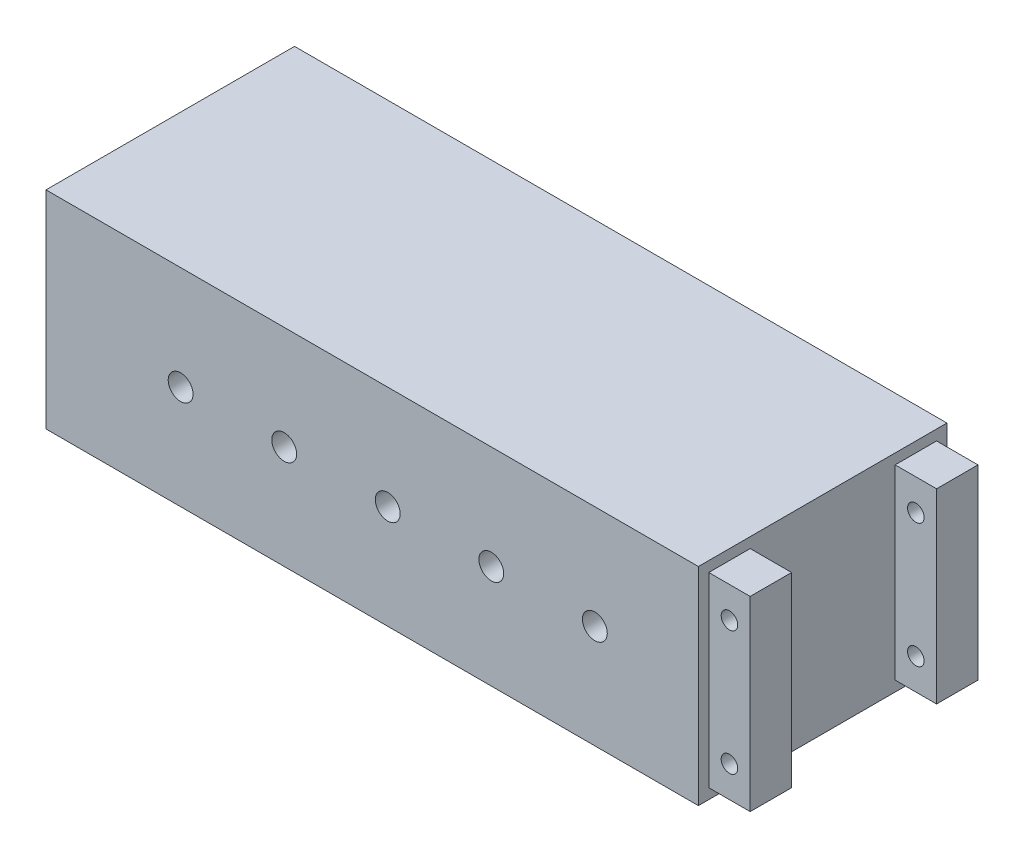
ISO-10303-21;
HEADER;
FILE_DESCRIPTION(('STEP AP214'),'2;1');
FILE_NAME('part.step','',(''),(''),'','','');
FILE_SCHEMA(('AUTOMOTIVE_DESIGN { 1 0 10303 214 1 1 1 1 }'));
ENDSEC;
DATA;
#1=APPLICATION_CONTEXT('core data for automotive mechanical design processes');
#2=APPLICATION_PROTOCOL_DEFINITION('international standard','automotive_design',2000,#1);
#3=PRODUCT_CONTEXT('',#1,'mechanical');
#4=PRODUCT('Part','Part','',(#3));
#5=PRODUCT_RELATED_PRODUCT_CATEGORY('part','',(#4));
#6=PRODUCT_DEFINITION_FORMATION('','',#4);
#7=PRODUCT_DEFINITION_CONTEXT('part definition',#1,'design');
#8=PRODUCT_DEFINITION('design','',#6,#7);
#9=PRODUCT_DEFINITION_SHAPE('','',#8);
#10=(LENGTH_UNIT() NAMED_UNIT(*) SI_UNIT(.MILLI.,.METRE.));
#11=(NAMED_UNIT(*) PLANE_ANGLE_UNIT() SI_UNIT($,.RADIAN.));
#12=(NAMED_UNIT(*) SI_UNIT($,.STERADIAN.) SOLID_ANGLE_UNIT());
#13=UNCERTAINTY_MEASURE_WITH_UNIT(LENGTH_MEASURE(1.E-05),#10,'distance_accuracy_value','');
#14=(GEOMETRIC_REPRESENTATION_CONTEXT(3) GLOBAL_UNCERTAINTY_ASSIGNED_CONTEXT((#13)) GLOBAL_UNIT_ASSIGNED_CONTEXT((#10,
#11,#12)) REPRESENTATION_CONTEXT('',''));
#15=CARTESIAN_POINT('',(0.,0.,0.));
#16=DIRECTION('',(0.,0.,1.));
#17=DIRECTION('',(1.,0.,0.));
#18=AXIS2_PLACEMENT_3D('',#15,#16,#17);
#19=CARTESIAN_POINT('',(157.5,35.,15.));
#20=DIRECTION('',(0.,0.,1.));
#21=DIRECTION('',(0.,-1.,0.));
#22=AXIS2_PLACEMENT_3D('',#19,#20,#21);
#23=PLANE('',#22);
#24=DIRECTION('',(0.,-1.,0.));
#25=VECTOR('',#24,1.);
#26=CARTESIAN_POINT('',(-10.,35.,15.));
#27=LINE('',#26,#25);
#28=CARTESIAN_POINT('',(-10.,35.,15.));
#29=VERTEX_POINT('',#28);
#30=CARTESIAN_POINT('',(-10.,15.,15.));
#31=VERTEX_POINT('',#30);
#32=EDGE_CURVE('E58',#29,#31,#27,.T.);
#33=ORIENTED_EDGE('',*,*,#32,.T.);
#34=DIRECTION('',(-1.,0.,0.));
#35=VECTOR('',#34,1.);
#36=CARTESIAN_POINT('',(157.5,15.,15.));
#37=LINE('',#36,#35);
#38=CARTESIAN_POINT('',(-157.5,15.,15.));
#39=VERTEX_POINT('',#38);
#40=EDGE_CURVE('E347',#31,#39,#37,.T.);
#41=ORIENTED_EDGE('',*,*,#40,.T.);
#42=DIRECTION('',(0.,1.,0.));
#43=VECTOR('',#42,1.);
#44=CARTESIAN_POINT('',(-157.5,35.,15.));
#45=LINE('',#44,#43);
#46=CARTESIAN_POINT('',(-157.5,35.,15.));
#47=VERTEX_POINT('',#46);
#48=EDGE_CURVE('E304',#39,#47,#45,.T.);
#49=ORIENTED_EDGE('',*,*,#48,.T.);
#50=DIRECTION('',(-1.,0.,0.));
#51=VECTOR('',#50,1.);
#52=CARTESIAN_POINT('',(157.5,35.,15.));
#53=LINE('',#52,#51);
#54=EDGE_CURVE('E45',#29,#47,#53,.T.);
#55=ORIENTED_EDGE('',*,*,#54,.F.);
#56=EDGE_LOOP('',(#33,#41,#49,#55));
#57=FACE_BOUND('',#56,.T.);
#58=ADVANCED_FACE('F41',(#57),#23,.F.);
#59=CARTESIAN_POINT('',(157.5,15.,-15.));
#60=DIRECTION('',(0.,-1.,0.));
#61=DIRECTION('',(0.,0.,-1.));
#62=AXIS2_PLACEMENT_3D('',#59,#60,#61);
#63=PLANE('',#62);
#64=DIRECTION('',(0.,0.,-1.));
#65=VECTOR('',#64,1.);
#66=CARTESIAN_POINT('',(-10.,15.,15.));
#67=LINE('',#66,#65);
#68=CARTESIAN_POINT('',(-10.,15.,-15.));
#69=VERTEX_POINT('',#68);
#70=EDGE_CURVE('E65',#31,#69,#67,.T.);
#71=ORIENTED_EDGE('',*,*,#70,.T.);
#72=DIRECTION('',(-1.,0.,0.));
#73=VECTOR('',#72,1.);
#74=CARTESIAN_POINT('',(157.5,15.,-15.));
#75=LINE('',#74,#73);
#76=CARTESIAN_POINT('',(-157.5,15.,-15.));
#77=VERTEX_POINT('',#76);
#78=EDGE_CURVE('E166',#69,#77,#75,.T.);
#79=ORIENTED_EDGE('',*,*,#78,.T.);
#80=DIRECTION('',(0.,0.,1.));
#81=VECTOR('',#80,1.);
#82=CARTESIAN_POINT('',(-157.5,15.,-15.));
#83=LINE('',#82,#81);
#84=EDGE_CURVE('E298',#77,#39,#83,.T.);
#85=ORIENTED_EDGE('',*,*,#84,.T.);
#86=ORIENTED_EDGE('',*,*,#40,.F.);
#87=EDGE_LOOP('',(#71,#79,#85,#86));
#88=FACE_BOUND('',#87,.T.);
#89=ADVANCED_FACE('F349',(#88),#63,.F.);
#90=CARTESIAN_POINT('',(157.5,35.,-15.));
#91=DIRECTION('',(0.,0.,-1.));
#92=DIRECTION('',(0.,1.,0.));
#93=AXIS2_PLACEMENT_3D('',#90,#91,#92);
#94=PLANE('',#93);
#95=DIRECTION('',(0.,1.,0.));
#96=VECTOR('',#95,1.);
#97=CARTESIAN_POINT('',(-10.,35.,-15.));
#98=LINE('',#97,#96);
#99=CARTESIAN_POINT('',(-10.,35.,-15.));
#100=VERTEX_POINT('',#99);
#101=EDGE_CURVE('E168',#69,#100,#98,.T.);
#102=ORIENTED_EDGE('',*,*,#101,.T.);
#103=DIRECTION('',(-1.,0.,0.));
#104=VECTOR('',#103,1.);
#105=CARTESIAN_POINT('',(157.5,35.,-15.));
#106=LINE('',#105,#104);
#107=CARTESIAN_POINT('',(-157.5,35.,-15.));
#108=VERTEX_POINT('',#107);
#109=EDGE_CURVE('E156',#100,#108,#106,.T.);
#110=ORIENTED_EDGE('',*,*,#109,.T.);
#111=DIRECTION('',(0.,-1.,0.));
#112=VECTOR('',#111,1.);
#113=CARTESIAN_POINT('',(-157.5,35.,-15.));
#114=LINE('',#113,#112);
#115=EDGE_CURVE('E301',#108,#77,#114,.T.);
#116=ORIENTED_EDGE('',*,*,#115,.T.);
#117=ORIENTED_EDGE('',*,*,#78,.F.);
#118=EDGE_LOOP('',(#102,#110,#116,#117));
#119=FACE_BOUND('',#118,.T.);
#120=ADVANCED_FACE('F169',(#119),#94,.F.);
#121=CARTESIAN_POINT('',(157.5,35.,-15.));
#122=DIRECTION('',(0.,1.,0.));
#123=DIRECTION('',(0.,0.,1.));
#124=AXIS2_PLACEMENT_3D('',#121,#122,#123);
#125=PLANE('',#124);
#126=DIRECTION('',(0.,0.,1.));
#127=VECTOR('',#126,1.);
#128=CARTESIAN_POINT('',(-10.,35.,15.));
#129=LINE('',#128,#127);
#130=EDGE_CURVE('E160',#100,#29,#129,.T.);
#131=ORIENTED_EDGE('',*,*,#130,.T.);
#132=ORIENTED_EDGE('',*,*,#54,.T.);
#133=DIRECTION('',(0.,0.,-1.));
#134=VECTOR('',#133,1.);
#135=CARTESIAN_POINT('',(-157.5,35.,-15.));
#136=LINE('',#135,#134);
#137=EDGE_CURVE('E162',#47,#108,#136,.T.);
#138=ORIENTED_EDGE('',*,*,#137,.T.);
#139=ORIENTED_EDGE('',*,*,#109,.F.);
#140=EDGE_LOOP('',(#131,#132,#138,#139));
#141=FACE_BOUND('',#140,.T.);
#142=ADVANCED_FACE('F158',(#141),#125,.F.);
#143=CARTESIAN_POINT('',(0.,0.,0.));
#144=DIRECTION('',(1.,0.,0.));
#145=DIRECTION('',(0.,0.,-1.));
#146=AXIS2_PLACEMENT_3D('',#143,#144,#145);
#147=PLANE('',#146);
#148=DIRECTION('',(0.,0.,-1.));
#149=VECTOR('',#148,1.);
#150=CARTESIAN_POINT('',(0.,50.,0.));
#151=LINE('',#150,#149);
#152=CARTESIAN_POINT('',(0.,50.,30.));
#153=VERTEX_POINT('',#152);
#154=CARTESIAN_POINT('',(0.,50.,-30.));
#155=VERTEX_POINT('',#154);
#156=EDGE_CURVE('E287',#153,#155,#151,.T.);
#157=ORIENTED_EDGE('',*,*,#156,.F.);
#158=DIRECTION('',(0.,-1.,0.));
#159=VECTOR('',#158,1.);
#160=CARTESIAN_POINT('',(0.,50.,30.));
#161=LINE('',#160,#159);
#162=CARTESIAN_POINT('',(0.,0.,30.));
#163=VERTEX_POINT('',#162);
#164=EDGE_CURVE('E337',#153,#163,#161,.T.);
#165=ORIENTED_EDGE('',*,*,#164,.T.);
#166=DIRECTION('',(0.,0.,-1.));
#167=VECTOR('',#166,1.);
#168=CARTESIAN_POINT('',(0.,0.,0.));
#169=LINE('',#168,#167);
#170=CARTESIAN_POINT('',(0.,0.,-30.));
#171=VERTEX_POINT('',#170);
#172=EDGE_CURVE('E255',#163,#171,#169,.T.);
#173=ORIENTED_EDGE('',*,*,#172,.T.);
#174=DIRECTION('',(0.,1.,0.));
#175=VECTOR('',#174,1.);
#176=CARTESIAN_POINT('',(0.,50.,-30.));
#177=LINE('',#176,#175);
#178=EDGE_CURVE('E334',#171,#155,#177,.T.);
#179=ORIENTED_EDGE('',*,*,#178,.T.);
#180=EDGE_LOOP('',(#157,#165,#173,#179));
#181=FACE_BOUND('',#180,.T.);
#182=DIRECTION('',(0.,0.,1.));
#183=VECTOR('',#182,1.);
#184=CARTESIAN_POINT('',(0.,47.5,-27.5));
#185=LINE('',#184,#183);
#186=CARTESIAN_POINT('',(0.,47.5,-27.5));
#187=VERTEX_POINT('',#186);
#188=CARTESIAN_POINT('',(0.,47.5,-17.5));
#189=VERTEX_POINT('',#188);
#190=EDGE_CURVE('E272',#187,#189,#185,.T.);
#191=ORIENTED_EDGE('',*,*,#190,.F.);
#192=DIRECTION('',(0.,1.,0.));
#193=VECTOR('',#192,1.);
#194=CARTESIAN_POINT('',(0.,47.5,-27.5));
#195=LINE('',#194,#193);
#196=CARTESIAN_POINT('',(0.,2.5,-27.5));
#197=VERTEX_POINT('',#196);
#198=EDGE_CURVE('E240',#197,#187,#195,.T.);
#199=ORIENTED_EDGE('',*,*,#198,.F.);
#200=DIRECTION('',(0.,0.,-1.));
#201=VECTOR('',#200,1.);
#202=CARTESIAN_POINT('',(0.,2.5,-27.5));
#203=LINE('',#202,#201);
#204=CARTESIAN_POINT('',(0.,2.5,-17.5));
#205=VERTEX_POINT('',#204);
#206=EDGE_CURVE('E266',#205,#197,#203,.T.);
#207=ORIENTED_EDGE('',*,*,#206,.F.);
#208=DIRECTION('',(0.,-1.,0.));
#209=VECTOR('',#208,1.);
#210=CARTESIAN_POINT('',(0.,47.5,-17.5));
#211=LINE('',#210,#209);
#212=EDGE_CURVE('E268',#189,#205,#211,.T.);
#213=ORIENTED_EDGE('',*,*,#212,.F.);
#214=EDGE_LOOP('',(#191,#199,#207,#213));
#215=FACE_BOUND('',#214,.T.);
#216=DIRECTION('',(0.,0.,1.));
#217=VECTOR('',#216,1.);
#218=CARTESIAN_POINT('',(0.,47.5,27.5));
#219=LINE('',#218,#217);
#220=CARTESIAN_POINT('',(0.,47.5,17.5));
#221=VERTEX_POINT('',#220);
#222=CARTESIAN_POINT('',(0.,47.5,27.5));
#223=VERTEX_POINT('',#222);
#224=EDGE_CURVE('E239',#221,#223,#219,.T.);
#225=ORIENTED_EDGE('',*,*,#224,.F.);
#226=DIRECTION('',(0.,1.,0.));
#227=VECTOR('',#226,1.);
#228=CARTESIAN_POINT('',(0.,47.5,17.5));
#229=LINE('',#228,#227);
#230=CARTESIAN_POINT('',(0.,2.5,17.5));
#231=VERTEX_POINT('',#230);
#232=EDGE_CURVE('E236',#231,#221,#229,.T.);
#233=ORIENTED_EDGE('',*,*,#232,.F.);
#234=DIRECTION('',(0.,0.,-1.));
#235=VECTOR('',#234,1.);
#236=CARTESIAN_POINT('',(0.,2.5,27.5));
#237=LINE('',#236,#235);
#238=CARTESIAN_POINT('',(0.,2.5,27.5));
#239=VERTEX_POINT('',#238);
#240=EDGE_CURVE('E229',#239,#231,#237,.T.);
#241=ORIENTED_EDGE('',*,*,#240,.F.);
#242=DIRECTION('',(0.,-1.,0.));
#243=VECTOR('',#242,1.);
#244=CARTESIAN_POINT('',(0.,47.5,27.5));
#245=LINE('',#244,#243);
#246=EDGE_CURVE('E242',#223,#239,#245,.T.);
#247=ORIENTED_EDGE('',*,*,#246,.F.);
#248=EDGE_LOOP('',(#225,#233,#241,#247));
#249=FACE_BOUND('',#248,.T.);
#250=ADVANCED_FACE('F367',(#181,#215,#249),#147,.T.);
#251=CARTESIAN_POINT('',(-157.5,50.,-30.));
#252=DIRECTION('',(0.,0.,1.));
#253=DIRECTION('',(1.,0.,0.));
#254=AXIS2_PLACEMENT_3D('',#251,#252,#253);
#255=PLANE('',#254);
#256=CARTESIAN_POINT('',(-30.,40.,-30.));
#257=DIRECTION('',(0.,0.,-1.));
#258=DIRECTION('',(-1.,0.,0.));
#259=AXIS2_PLACEMENT_3D('',#256,#257,#258);
#260=CIRCLE('',#259,2.);
#261=CARTESIAN_POINT('',(-32.,40.,-30.));
#262=VERTEX_POINT('',#261);
#263=EDGE_CURVE('E184',#262,#262,#260,.T.);
#264=ORIENTED_EDGE('',*,*,#263,.F.);
#265=EDGE_LOOP('',(#264));
#266=FACE_BOUND('',#265,.T.);
#267=CARTESIAN_POINT('',(-30.,10.,-30.));
#268=DIRECTION('',(0.,0.,-1.));
#269=DIRECTION('',(1.,0.,0.));
#270=AXIS2_PLACEMENT_3D('',#267,#268,#269);
#271=CIRCLE('',#270,2.);
#272=CARTESIAN_POINT('',(-28.,10.,-30.));
#273=VERTEX_POINT('',#272);
#274=EDGE_CURVE('E176',#273,#273,#271,.T.);
#275=ORIENTED_EDGE('',*,*,#274,.F.);
#276=EDGE_LOOP('',(#275));
#277=FACE_BOUND('',#276,.T.);
#278=ORIENTED_EDGE('',*,*,#178,.F.);
#279=DIRECTION('',(-1.,0.,0.));
#280=VECTOR('',#279,1.);
#281=CARTESIAN_POINT('',(-157.5,0.,-30.));
#282=LINE('',#281,#280);
#283=CARTESIAN_POINT('',(-157.5,0.,-30.));
#284=VERTEX_POINT('',#283);
#285=EDGE_CURVE('E293',#171,#284,#282,.T.);
#286=ORIENTED_EDGE('',*,*,#285,.T.);
#287=DIRECTION('',(0.,-1.,0.));
#288=VECTOR('',#287,1.);
#289=CARTESIAN_POINT('',(-157.5,50.,-30.));
#290=LINE('',#289,#288);
#291=CARTESIAN_POINT('',(-157.5,50.,-30.));
#292=VERTEX_POINT('',#291);
#293=EDGE_CURVE('E283',#292,#284,#290,.T.);
#294=ORIENTED_EDGE('',*,*,#293,.F.);
#295=DIRECTION('',(-1.,0.,0.));
#296=VECTOR('',#295,1.);
#297=CARTESIAN_POINT('',(-157.5,50.,-30.));
#298=LINE('',#297,#296);
#299=EDGE_CURVE('E297',#155,#292,#298,.T.);
#300=ORIENTED_EDGE('',*,*,#299,.F.);
#301=EDGE_LOOP('',(#278,#286,#294,#300));
#302=FACE_BOUND('',#301,.T.);
#303=ADVANCED_FACE('F368',(#266,#277,#302),#255,.F.);
#304=CARTESIAN_POINT('',(-157.5,50.,30.));
#305=DIRECTION('',(0.,0.,-1.));
#306=DIRECTION('',(-1.,0.,0.));
#307=AXIS2_PLACEMENT_3D('',#304,#305,#306);
#308=PLANE('',#307);
#309=CARTESIAN_POINT('',(-25.,25.,30.));
#310=DIRECTION('',(0.,0.,1.));
#311=DIRECTION('',(1.,0.,0.));
#312=AXIS2_PLACEMENT_3D('',#309,#310,#311);
#313=CIRCLE('',#312,3.);
#314=CARTESIAN_POINT('',(-22.,25.,30.));
#315=VERTEX_POINT('',#314);
#316=EDGE_CURVE('E308',#315,#315,#313,.T.);
#317=ORIENTED_EDGE('',*,*,#316,.F.);
#318=EDGE_LOOP('',(#317));
#319=FACE_BOUND('',#318,.T.);
#320=CARTESIAN_POINT('',(-50.,24.9999999999998,30.));
#321=DIRECTION('',(0.,0.,1.));
#322=DIRECTION('',(1.,0.,0.));
#323=AXIS2_PLACEMENT_3D('',#320,#321,#322);
#324=CIRCLE('',#323,3.);
#325=CARTESIAN_POINT('',(-47.,24.9999999999998,30.));
#326=VERTEX_POINT('',#325);
#327=EDGE_CURVE('E311',#326,#326,#324,.T.);
#328=ORIENTED_EDGE('',*,*,#327,.F.);
#329=EDGE_LOOP('',(#328));
#330=FACE_BOUND('',#329,.T.);
#331=CARTESIAN_POINT('',(-75.,24.9999999999997,30.));
#332=DIRECTION('',(0.,0.,1.));
#333=DIRECTION('',(1.,0.,0.));
#334=AXIS2_PLACEMENT_3D('',#331,#332,#333);
#335=CIRCLE('',#334,3.00000000000001);
#336=CARTESIAN_POINT('',(-72.,24.9999999999997,30.));
#337=VERTEX_POINT('',#336);
#338=EDGE_CURVE('E323',#337,#337,#335,.T.);
#339=ORIENTED_EDGE('',*,*,#338,.F.);
#340=EDGE_LOOP('',(#339));
#341=FACE_BOUND('',#340,.T.);
#342=CARTESIAN_POINT('',(-100.,24.9999999999995,30.));
#343=DIRECTION('',(0.,0.,1.));
#344=DIRECTION('',(1.,0.,0.));
#345=AXIS2_PLACEMENT_3D('',#342,#343,#344);
#346=CIRCLE('',#345,2.99999999999999);
#347=CARTESIAN_POINT('',(-97.,24.9999999999995,30.));
#348=VERTEX_POINT('',#347);
#349=EDGE_CURVE('E317',#348,#348,#346,.T.);
#350=ORIENTED_EDGE('',*,*,#349,.F.);
#351=EDGE_LOOP('',(#350));
#352=FACE_BOUND('',#351,.T.);
#353=CARTESIAN_POINT('',(-125.,24.9999999999993,30.));
#354=DIRECTION('',(0.,0.,1.));
#355=DIRECTION('',(1.,0.,0.));
#356=AXIS2_PLACEMENT_3D('',#353,#354,#355);
#357=CIRCLE('',#356,2.99999999999999);
#358=CARTESIAN_POINT('',(-122.,24.9999999999993,30.));
#359=VERTEX_POINT('',#358);
#360=EDGE_CURVE('E50',#359,#359,#357,.T.);
#361=ORIENTED_EDGE('',*,*,#360,.F.);
#362=EDGE_LOOP('',(#361));
#363=FACE_BOUND('',#362,.T.);
#364=ORIENTED_EDGE('',*,*,#164,.F.);
#365=DIRECTION('',(1.,0.,0.));
#366=VECTOR('',#365,1.);
#367=CARTESIAN_POINT('',(-157.5,50.,30.));
#368=LINE('',#367,#366);
#369=CARTESIAN_POINT('',(-157.5,50.,30.));
#370=VERTEX_POINT('',#369);
#371=EDGE_CURVE('E290',#370,#153,#368,.T.);
#372=ORIENTED_EDGE('',*,*,#371,.F.);
#373=DIRECTION('',(0.,-1.,0.));
#374=VECTOR('',#373,1.);
#375=CARTESIAN_POINT('',(-157.5,50.,30.));
#376=LINE('',#375,#374);
#377=CARTESIAN_POINT('',(-157.5,0.,30.));
#378=VERTEX_POINT('',#377);
#379=EDGE_CURVE('E286',#370,#378,#376,.T.);
#380=ORIENTED_EDGE('',*,*,#379,.T.);
#381=DIRECTION('',(1.,0.,0.));
#382=VECTOR('',#381,1.);
#383=CARTESIAN_POINT('',(-157.5,0.,30.));
#384=LINE('',#383,#382);
#385=EDGE_CURVE('E294',#378,#163,#384,.T.);
#386=ORIENTED_EDGE('',*,*,#385,.T.);
#387=EDGE_LOOP('',(#364,#372,#380,#386));
#388=FACE_BOUND('',#387,.T.);
#389=ADVANCED_FACE('F371',(#319,#330,#341,#352,#363,#388),#308,.F.);
#390=CARTESIAN_POINT('',(0.,50.,0.));
#391=DIRECTION('',(0.,1.,0.));
#392=DIRECTION('',(0.,0.,1.));
#393=AXIS2_PLACEMENT_3D('',#390,#391,#392);
#394=PLANE('',#393);
#395=ORIENTED_EDGE('',*,*,#371,.T.);
#396=ORIENTED_EDGE('',*,*,#156,.T.);
#397=ORIENTED_EDGE('',*,*,#299,.T.);
#398=DIRECTION('',(0.,0.,1.));
#399=VECTOR('',#398,1.);
#400=CARTESIAN_POINT('',(-157.5,50.,-30.));
#401=LINE('',#400,#399);
#402=EDGE_CURVE('E295',#292,#370,#401,.T.);
#403=ORIENTED_EDGE('',*,*,#402,.T.);
#404=EDGE_LOOP('',(#395,#396,#397,#403));
#405=FACE_BOUND('',#404,.T.);
#406=ADVANCED_FACE('F43',(#405),#394,.T.);
#407=CARTESIAN_POINT('',(0.,0.,0.));
#408=DIRECTION('',(0.,1.,0.));
#409=DIRECTION('',(0.,0.,1.));
#410=AXIS2_PLACEMENT_3D('',#407,#408,#409);
#411=PLANE('',#410);
#412=CARTESIAN_POINT('',(-137.5,0.,-15.));
#413=DIRECTION('',(0.,-1.,0.));
#414=DIRECTION('',(0.,0.,-1.));
#415=AXIS2_PLACEMENT_3D('',#412,#413,#414);
#416=CIRCLE('',#415,2.);
#417=CARTESIAN_POINT('',(-137.5,0.,-17.));
#418=VERTEX_POINT('',#417);
#419=EDGE_CURVE('E189',#418,#418,#416,.T.);
#420=ORIENTED_EDGE('',*,*,#419,.F.);
#421=EDGE_LOOP('',(#420));
#422=FACE_BOUND('',#421,.T.);
#423=CARTESIAN_POINT('',(-137.5,0.,15.));
#424=DIRECTION('',(0.,-1.,0.));
#425=DIRECTION('',(0.,0.,1.));
#426=AXIS2_PLACEMENT_3D('',#423,#424,#425);
#427=CIRCLE('',#426,2.);
#428=CARTESIAN_POINT('',(-137.5,0.,17.));
#429=VERTEX_POINT('',#428);
#430=EDGE_CURVE('E196',#429,#429,#427,.T.);
#431=ORIENTED_EDGE('',*,*,#430,.F.);
#432=EDGE_LOOP('',(#431));
#433=FACE_BOUND('',#432,.T.);
#434=ORIENTED_EDGE('',*,*,#172,.F.);
#435=ORIENTED_EDGE('',*,*,#385,.F.);
#436=DIRECTION('',(0.,0.,1.));
#437=VECTOR('',#436,1.);
#438=CARTESIAN_POINT('',(-157.5,0.,-30.));
#439=LINE('',#438,#437);
#440=EDGE_CURVE('E291',#284,#378,#439,.T.);
#441=ORIENTED_EDGE('',*,*,#440,.F.);
#442=ORIENTED_EDGE('',*,*,#285,.F.);
#443=EDGE_LOOP('',(#434,#435,#441,#442));
#444=FACE_BOUND('',#443,.T.);
#445=ADVANCED_FACE('F375',(#422,#433,#444),#411,.F.);
#446=CARTESIAN_POINT('',(-157.5,50.,-30.));
#447=DIRECTION('',(1.,0.,0.));
#448=DIRECTION('',(0.,0.,-1.));
#449=AXIS2_PLACEMENT_3D('',#446,#447,#448);
#450=PLANE('',#449);
#451=ORIENTED_EDGE('',*,*,#137,.F.);
#452=ORIENTED_EDGE('',*,*,#48,.F.);
#453=ORIENTED_EDGE('',*,*,#84,.F.);
#454=ORIENTED_EDGE('',*,*,#115,.F.);
#455=EDGE_LOOP('',(#451,#452,#453,#454));
#456=FACE_BOUND('',#455,.T.);
#457=ORIENTED_EDGE('',*,*,#440,.T.);
#458=ORIENTED_EDGE('',*,*,#379,.F.);
#459=ORIENTED_EDGE('',*,*,#402,.F.);
#460=ORIENTED_EDGE('',*,*,#293,.T.);
#461=EDGE_LOOP('',(#457,#458,#459,#460));
#462=FACE_BOUND('',#461,.T.);
#463=ADVANCED_FACE('F353',(#456,#462),#450,.F.);
#464=CARTESIAN_POINT('',(-25.,25.,20.));
#465=DIRECTION('',(0.,0.,1.));
#466=DIRECTION('',(1.,0.,0.));
#467=AXIS2_PLACEMENT_3D('',#464,#465,#466);
#468=CYLINDRICAL_SURFACE('',#467,3.);
#469=CARTESIAN_POINT('',(-25.,25.,20.));
#470=DIRECTION('',(0.,0.,1.));
#471=DIRECTION('',(1.,0.,0.));
#472=AXIS2_PLACEMENT_3D('',#469,#470,#471);
#473=CIRCLE('',#472,3.);
#474=CARTESIAN_POINT('',(-22.,25.,20.));
#475=VERTEX_POINT('',#474);
#476=EDGE_CURVE('E307',#475,#475,#473,.T.);
#477=ORIENTED_EDGE('',*,*,#476,.F.);
#478=EDGE_LOOP('',(#477));
#479=FACE_BOUND('',#478,.T.);
#480=ORIENTED_EDGE('',*,*,#316,.T.);
#481=EDGE_LOOP('',(#480));
#482=FACE_BOUND('',#481,.T.);
#483=ADVANCED_FACE('F383',(#479,#482),#468,.F.);
#484=CARTESIAN_POINT('',(-25.,25.,20.));
#485=DIRECTION('',(0.,0.,1.));
#486=DIRECTION('',(1.,0.,0.));
#487=AXIS2_PLACEMENT_3D('',#484,#485,#486);
#488=PLANE('',#487);
#489=ORIENTED_EDGE('',*,*,#476,.T.);
#490=EDGE_LOOP('',(#489));
#491=FACE_BOUND('',#490,.T.);
#492=ADVANCED_FACE('F472',(#491),#488,.T.);
#493=CARTESIAN_POINT('',(-50.,24.9999999999998,20.));
#494=DIRECTION('',(0.,0.,1.));
#495=DIRECTION('',(1.,0.,0.));
#496=AXIS2_PLACEMENT_3D('',#493,#494,#495);
#497=CYLINDRICAL_SURFACE('',#496,3.);
#498=CARTESIAN_POINT('',(-50.,24.9999999999998,20.));
#499=DIRECTION('',(0.,0.,1.));
#500=DIRECTION('',(1.,0.,0.));
#501=AXIS2_PLACEMENT_3D('',#498,#499,#500);
#502=CIRCLE('',#501,3.);
#503=CARTESIAN_POINT('',(-47.,24.9999999999998,20.));
#504=VERTEX_POINT('',#503);
#505=EDGE_CURVE('E326',#504,#504,#502,.T.);
#506=ORIENTED_EDGE('',*,*,#505,.F.);
#507=EDGE_LOOP('',(#506));
#508=FACE_BOUND('',#507,.T.);
#509=ORIENTED_EDGE('',*,*,#327,.T.);
#510=EDGE_LOOP('',(#509));
#511=FACE_BOUND('',#510,.T.);
#512=ADVANCED_FACE('F476',(#508,#511),#497,.F.);
#513=CARTESIAN_POINT('',(-50.,24.9999999999998,20.));
#514=DIRECTION('',(0.,0.,1.));
#515=DIRECTION('',(1.,0.,0.));
#516=AXIS2_PLACEMENT_3D('',#513,#514,#515);
#517=PLANE('',#516);
#518=ORIENTED_EDGE('',*,*,#505,.T.);
#519=EDGE_LOOP('',(#518));
#520=FACE_BOUND('',#519,.T.);
#521=ADVANCED_FACE('F494',(#520),#517,.T.);
#522=CARTESIAN_POINT('',(-75.,24.9999999999997,20.));
#523=DIRECTION('',(0.,0.,1.));
#524=DIRECTION('',(1.,0.,0.));
#525=AXIS2_PLACEMENT_3D('',#522,#523,#524);
#526=CYLINDRICAL_SURFACE('',#525,3.00000000000001);
#527=CARTESIAN_POINT('',(-75.,24.9999999999997,20.));
#528=DIRECTION('',(0.,0.,1.));
#529=DIRECTION('',(1.,0.,0.));
#530=AXIS2_PLACEMENT_3D('',#527,#528,#529);
#531=CIRCLE('',#530,3.00000000000001);
#532=CARTESIAN_POINT('',(-72.,24.9999999999997,20.));
#533=VERTEX_POINT('',#532);
#534=EDGE_CURVE('E320',#533,#533,#531,.T.);
#535=ORIENTED_EDGE('',*,*,#534,.F.);
#536=EDGE_LOOP('',(#535));
#537=FACE_BOUND('',#536,.T.);
#538=ORIENTED_EDGE('',*,*,#338,.T.);
#539=EDGE_LOOP('',(#538));
#540=FACE_BOUND('',#539,.T.);
#541=ADVANCED_FACE('F490',(#537,#540),#526,.F.);
#542=CARTESIAN_POINT('',(-75.,24.9999999999997,20.));
#543=DIRECTION('',(0.,0.,1.));
#544=DIRECTION('',(1.,0.,0.));
#545=AXIS2_PLACEMENT_3D('',#542,#543,#544);
#546=PLANE('',#545);
#547=ORIENTED_EDGE('',*,*,#534,.T.);
#548=EDGE_LOOP('',(#547));
#549=FACE_BOUND('',#548,.T.);
#550=ADVANCED_FACE('F486',(#549),#546,.T.);
#551=CARTESIAN_POINT('',(-100.,24.9999999999995,20.));
#552=DIRECTION('',(0.,0.,1.));
#553=DIRECTION('',(1.,0.,0.));
#554=AXIS2_PLACEMENT_3D('',#551,#552,#553);
#555=CYLINDRICAL_SURFACE('',#554,2.99999999999999);
#556=CARTESIAN_POINT('',(-100.,24.9999999999995,20.));
#557=DIRECTION('',(0.,0.,1.));
#558=DIRECTION('',(1.,0.,0.));
#559=AXIS2_PLACEMENT_3D('',#556,#557,#558);
#560=CIRCLE('',#559,2.99999999999999);
#561=CARTESIAN_POINT('',(-97.,24.9999999999995,20.));
#562=VERTEX_POINT('',#561);
#563=EDGE_CURVE('E314',#562,#562,#560,.T.);
#564=ORIENTED_EDGE('',*,*,#563,.F.);
#565=EDGE_LOOP('',(#564));
#566=FACE_BOUND('',#565,.T.);
#567=ORIENTED_EDGE('',*,*,#349,.T.);
#568=EDGE_LOOP('',(#567));
#569=FACE_BOUND('',#568,.T.);
#570=ADVANCED_FACE('F482',(#566,#569),#555,.F.);
#571=CARTESIAN_POINT('',(-100.,24.9999999999995,20.));
#572=DIRECTION('',(0.,0.,1.));
#573=DIRECTION('',(1.,0.,0.));
#574=AXIS2_PLACEMENT_3D('',#571,#572,#573);
#575=PLANE('',#574);
#576=ORIENTED_EDGE('',*,*,#563,.T.);
#577=EDGE_LOOP('',(#576));
#578=FACE_BOUND('',#577,.T.);
#579=ADVANCED_FACE('F478',(#578),#575,.T.);
#580=CARTESIAN_POINT('',(-125.,24.9999999999993,20.));
#581=DIRECTION('',(0.,0.,1.));
#582=DIRECTION('',(1.,0.,0.));
#583=AXIS2_PLACEMENT_3D('',#580,#581,#582);
#584=CYLINDRICAL_SURFACE('',#583,2.99999999999999);
#585=CARTESIAN_POINT('',(-125.,24.9999999999993,20.));
#586=DIRECTION('',(0.,0.,1.));
#587=DIRECTION('',(1.,0.,0.));
#588=AXIS2_PLACEMENT_3D('',#585,#586,#587);
#589=CIRCLE('',#588,2.99999999999999);
#590=CARTESIAN_POINT('',(-122.,24.9999999999993,20.));
#591=VERTEX_POINT('',#590);
#592=EDGE_CURVE('E11',#591,#591,#589,.T.);
#593=ORIENTED_EDGE('',*,*,#592,.F.);
#594=EDGE_LOOP('',(#593));
#595=FACE_BOUND('',#594,.T.);
#596=ORIENTED_EDGE('',*,*,#360,.T.);
#597=EDGE_LOOP('',(#596));
#598=FACE_BOUND('',#597,.T.);
#599=ADVANCED_FACE('F481',(#595,#598),#584,.F.);
#600=CARTESIAN_POINT('',(-125.,24.9999999999993,20.));
#601=DIRECTION('',(0.,0.,1.));
#602=DIRECTION('',(1.,0.,0.));
#603=AXIS2_PLACEMENT_3D('',#600,#601,#602);
#604=PLANE('',#603);
#605=ORIENTED_EDGE('',*,*,#592,.T.);
#606=EDGE_LOOP('',(#605));
#607=FACE_BOUND('',#606,.T.);
#608=ADVANCED_FACE('F454',(#607),#604,.T.);
#609=CARTESIAN_POINT('',(10.,47.5,-27.5));
#610=DIRECTION('',(0.,0.,1.));
#611=DIRECTION('',(0.,-1.,0.));
#612=AXIS2_PLACEMENT_3D('',#609,#610,#611);
#613=PLANE('',#612);
#614=CARTESIAN_POINT('',(5.,40.,-27.5));
#615=DIRECTION('',(0.,0.,1.));
#616=DIRECTION('',(0.,-1.,0.));
#617=AXIS2_PLACEMENT_3D('',#614,#615,#616);
#618=CIRCLE('',#617,2.);
#619=CARTESIAN_POINT('',(5.,38.,-27.5));
#620=VERTEX_POINT('',#619);
#621=EDGE_CURVE('E221',#620,#620,#618,.T.);
#622=ORIENTED_EDGE('',*,*,#621,.T.);
#623=EDGE_LOOP('',(#622));
#624=FACE_BOUND('',#623,.T.);
#625=CARTESIAN_POINT('',(5.,10.,-27.5));
#626=DIRECTION('',(0.,0.,1.));
#627=DIRECTION('',(0.,-1.,0.));
#628=AXIS2_PLACEMENT_3D('',#625,#626,#627);
#629=CIRCLE('',#628,2.);
#630=CARTESIAN_POINT('',(5.,8.00000000000001,-27.5));
#631=VERTEX_POINT('',#630);
#632=EDGE_CURVE('E212',#631,#631,#629,.T.);
#633=ORIENTED_EDGE('',*,*,#632,.T.);
#634=EDGE_LOOP('',(#633));
#635=FACE_BOUND('',#634,.T.);
#636=ORIENTED_EDGE('',*,*,#198,.T.);
#637=DIRECTION('',(-1.,0.,0.));
#638=VECTOR('',#637,1.);
#639=CARTESIAN_POINT('',(10.,47.5,-27.5));
#640=LINE('',#639,#638);
#641=CARTESIAN_POINT('',(10.,47.5,-27.5));
#642=VERTEX_POINT('',#641);
#643=EDGE_CURVE('E224',#642,#187,#640,.T.);
#644=ORIENTED_EDGE('',*,*,#643,.F.);
#645=DIRECTION('',(0.,1.,0.));
#646=VECTOR('',#645,1.);
#647=CARTESIAN_POINT('',(10.,47.5,-27.5));
#648=LINE('',#647,#646);
#649=CARTESIAN_POINT('',(10.,2.5,-27.5));
#650=VERTEX_POINT('',#649);
#651=EDGE_CURVE('E269',#650,#642,#648,.T.);
#652=ORIENTED_EDGE('',*,*,#651,.F.);
#653=DIRECTION('',(-1.,0.,0.));
#654=VECTOR('',#653,1.);
#655=CARTESIAN_POINT('',(10.,2.5,-27.5));
#656=LINE('',#655,#654);
#657=EDGE_CURVE('E262',#650,#197,#656,.T.);
#658=ORIENTED_EDGE('',*,*,#657,.T.);
#659=EDGE_LOOP('',(#636,#644,#652,#658));
#660=FACE_BOUND('',#659,.T.);
#661=ADVANCED_FACE('F450',(#624,#635,#660),#613,.F.);
#662=CARTESIAN_POINT('',(10.,47.5,-27.5));
#663=DIRECTION('',(0.,-1.,0.));
#664=DIRECTION('',(0.,0.,-1.));
#665=AXIS2_PLACEMENT_3D('',#662,#663,#664);
#666=PLANE('',#665);
#667=ORIENTED_EDGE('',*,*,#190,.T.);
#668=DIRECTION('',(-1.,0.,0.));
#669=VECTOR('',#668,1.);
#670=CARTESIAN_POINT('',(10.,47.5,-17.5));
#671=LINE('',#670,#669);
#672=CARTESIAN_POINT('',(10.,47.5,-17.5));
#673=VERTEX_POINT('',#672);
#674=EDGE_CURVE('E257',#673,#189,#671,.T.);
#675=ORIENTED_EDGE('',*,*,#674,.F.);
#676=DIRECTION('',(0.,0.,1.));
#677=VECTOR('',#676,1.);
#678=CARTESIAN_POINT('',(10.,47.5,-27.5));
#679=LINE('',#678,#677);
#680=EDGE_CURVE('E279',#642,#673,#679,.T.);
#681=ORIENTED_EDGE('',*,*,#680,.F.);
#682=ORIENTED_EDGE('',*,*,#643,.T.);
#683=EDGE_LOOP('',(#667,#675,#681,#682));
#684=FACE_BOUND('',#683,.T.);
#685=ADVANCED_FACE('F453',(#684),#666,.F.);
#686=CARTESIAN_POINT('',(10.,47.5,-17.5));
#687=DIRECTION('',(0.,0.,-1.));
#688=DIRECTION('',(0.,1.,0.));
#689=AXIS2_PLACEMENT_3D('',#686,#687,#688);
#690=PLANE('',#689);
#691=CARTESIAN_POINT('',(5.,40.,-17.5));
#692=DIRECTION('',(0.,0.,-1.));
#693=DIRECTION('',(0.,1.,0.));
#694=AXIS2_PLACEMENT_3D('',#691,#692,#693);
#695=CIRCLE('',#694,2.);
#696=CARTESIAN_POINT('',(5.,42.,-17.5));
#697=VERTEX_POINT('',#696);
#698=EDGE_CURVE('E218',#697,#697,#695,.T.);
#699=ORIENTED_EDGE('',*,*,#698,.T.);
#700=EDGE_LOOP('',(#699));
#701=FACE_BOUND('',#700,.T.);
#702=CARTESIAN_POINT('',(5.,10.,-17.5));
#703=DIRECTION('',(0.,0.,-1.));
#704=DIRECTION('',(0.,1.,0.));
#705=AXIS2_PLACEMENT_3D('',#702,#703,#704);
#706=CIRCLE('',#705,2.);
#707=CARTESIAN_POINT('',(5.,12.,-17.5));
#708=VERTEX_POINT('',#707);
#709=EDGE_CURVE('E209',#708,#708,#706,.T.);
#710=ORIENTED_EDGE('',*,*,#709,.T.);
#711=EDGE_LOOP('',(#710));
#712=FACE_BOUND('',#711,.T.);
#713=ORIENTED_EDGE('',*,*,#212,.T.);
#714=DIRECTION('',(-1.,0.,0.));
#715=VECTOR('',#714,1.);
#716=CARTESIAN_POINT('',(10.,2.5,-17.5));
#717=LINE('',#716,#715);
#718=CARTESIAN_POINT('',(10.,2.5,-17.5));
#719=VERTEX_POINT('',#718);
#720=EDGE_CURVE('E260',#719,#205,#717,.T.);
#721=ORIENTED_EDGE('',*,*,#720,.F.);
#722=DIRECTION('',(0.,-1.,0.));
#723=VECTOR('',#722,1.);
#724=CARTESIAN_POINT('',(10.,47.5,-17.5));
#725=LINE('',#724,#723);
#726=EDGE_CURVE('E277',#673,#719,#725,.T.);
#727=ORIENTED_EDGE('',*,*,#726,.F.);
#728=ORIENTED_EDGE('',*,*,#674,.T.);
#729=EDGE_LOOP('',(#713,#721,#727,#728));
#730=FACE_BOUND('',#729,.T.);
#731=ADVANCED_FACE('F458',(#701,#712,#730),#690,.F.);
#732=CARTESIAN_POINT('',(10.,2.5,-27.5));
#733=DIRECTION('',(0.,1.,0.));
#734=DIRECTION('',(0.,0.,1.));
#735=AXIS2_PLACEMENT_3D('',#732,#733,#734);
#736=PLANE('',#735);
#737=ORIENTED_EDGE('',*,*,#206,.T.);
#738=ORIENTED_EDGE('',*,*,#657,.F.);
#739=DIRECTION('',(0.,0.,-1.));
#740=VECTOR('',#739,1.);
#741=CARTESIAN_POINT('',(10.,2.5,-27.5));
#742=LINE('',#741,#740);
#743=EDGE_CURVE('E265',#719,#650,#742,.T.);
#744=ORIENTED_EDGE('',*,*,#743,.F.);
#745=ORIENTED_EDGE('',*,*,#720,.T.);
#746=EDGE_LOOP('',(#737,#738,#744,#745));
#747=FACE_BOUND('',#746,.T.);
#748=ADVANCED_FACE('F462',(#747),#736,.F.);
#749=CARTESIAN_POINT('',(10.,0.,0.));
#750=DIRECTION('',(-1.,0.,0.));
#751=DIRECTION('',(0.,0.,1.));
#752=AXIS2_PLACEMENT_3D('',#749,#750,#751);
#753=PLANE('',#752);
#754=ORIENTED_EDGE('',*,*,#651,.T.);
#755=ORIENTED_EDGE('',*,*,#680,.T.);
#756=ORIENTED_EDGE('',*,*,#726,.T.);
#757=ORIENTED_EDGE('',*,*,#743,.T.);
#758=EDGE_LOOP('',(#754,#755,#756,#757));
#759=FACE_BOUND('',#758,.T.);
#760=ADVANCED_FACE('F448',(#759),#753,.F.);
#761=CARTESIAN_POINT('',(10.,47.5,17.5));
#762=DIRECTION('',(0.,0.,1.));
#763=DIRECTION('',(0.,-1.,0.));
#764=AXIS2_PLACEMENT_3D('',#761,#762,#763);
#765=PLANE('',#764);
#766=CARTESIAN_POINT('',(5.,40.,17.5));
#767=DIRECTION('',(0.,0.,1.));
#768=DIRECTION('',(0.,-1.,0.));
#769=AXIS2_PLACEMENT_3D('',#766,#767,#768);
#770=CIRCLE('',#769,2.);
#771=CARTESIAN_POINT('',(5.,38.,17.5));
#772=VERTEX_POINT('',#771);
#773=EDGE_CURVE('E215',#772,#772,#770,.T.);
#774=ORIENTED_EDGE('',*,*,#773,.T.);
#775=EDGE_LOOP('',(#774));
#776=FACE_BOUND('',#775,.T.);
#777=CARTESIAN_POINT('',(5.,10.,17.5));
#778=DIRECTION('',(0.,0.,1.));
#779=DIRECTION('',(0.,-1.,0.));
#780=AXIS2_PLACEMENT_3D('',#777,#778,#779);
#781=CIRCLE('',#780,2.);
#782=CARTESIAN_POINT('',(5.,8.00000000000001,17.5));
#783=VERTEX_POINT('',#782);
#784=EDGE_CURVE('E204',#783,#783,#781,.T.);
#785=ORIENTED_EDGE('',*,*,#784,.T.);
#786=EDGE_LOOP('',(#785));
#787=FACE_BOUND('',#786,.T.);
#788=ORIENTED_EDGE('',*,*,#232,.T.);
#789=DIRECTION('',(-1.,0.,0.));
#790=VECTOR('',#789,1.);
#791=CARTESIAN_POINT('',(10.,47.5,17.5));
#792=LINE('',#791,#790);
#793=CARTESIAN_POINT('',(10.,47.5,17.5));
#794=VERTEX_POINT('',#793);
#795=EDGE_CURVE('E253',#794,#221,#792,.T.);
#796=ORIENTED_EDGE('',*,*,#795,.F.);
#797=DIRECTION('',(0.,1.,0.));
#798=VECTOR('',#797,1.);
#799=CARTESIAN_POINT('',(10.,47.5,17.5));
#800=LINE('',#799,#798);
#801=CARTESIAN_POINT('',(10.,2.5,17.5));
#802=VERTEX_POINT('',#801);
#803=EDGE_CURVE('E225',#802,#794,#800,.T.);
#804=ORIENTED_EDGE('',*,*,#803,.F.);
#805=DIRECTION('',(-1.,0.,0.));
#806=VECTOR('',#805,1.);
#807=CARTESIAN_POINT('',(10.,2.5,17.5));
#808=LINE('',#807,#806);
#809=EDGE_CURVE('E235',#802,#231,#808,.T.);
#810=ORIENTED_EDGE('',*,*,#809,.T.);
#811=EDGE_LOOP('',(#788,#796,#804,#810));
#812=FACE_BOUND('',#811,.T.);
#813=ADVANCED_FACE('F428',(#776,#787,#812),#765,.F.);
#814=CARTESIAN_POINT('',(10.,47.5,27.5));
#815=DIRECTION('',(0.,-1.,0.));
#816=DIRECTION('',(0.,0.,-1.));
#817=AXIS2_PLACEMENT_3D('',#814,#815,#816);
#818=PLANE('',#817);
#819=ORIENTED_EDGE('',*,*,#224,.T.);
#820=DIRECTION('',(-1.,0.,0.));
#821=VECTOR('',#820,1.);
#822=CARTESIAN_POINT('',(10.,47.5,27.5));
#823=LINE('',#822,#821);
#824=CARTESIAN_POINT('',(10.,47.5,27.5));
#825=VERTEX_POINT('',#824);
#826=EDGE_CURVE('E250',#825,#223,#823,.T.);
#827=ORIENTED_EDGE('',*,*,#826,.F.);
#828=DIRECTION('',(0.,0.,1.));
#829=VECTOR('',#828,1.);
#830=CARTESIAN_POINT('',(10.,47.5,27.5));
#831=LINE('',#830,#829);
#832=EDGE_CURVE('E228',#794,#825,#831,.T.);
#833=ORIENTED_EDGE('',*,*,#832,.F.);
#834=ORIENTED_EDGE('',*,*,#795,.T.);
#835=EDGE_LOOP('',(#819,#827,#833,#834));
#836=FACE_BOUND('',#835,.T.);
#837=ADVANCED_FACE('F416',(#836),#818,.F.);
#838=CARTESIAN_POINT('',(10.,47.5,27.5));
#839=DIRECTION('',(0.,0.,-1.));
#840=DIRECTION('',(0.,1.,0.));
#841=AXIS2_PLACEMENT_3D('',#838,#839,#840);
#842=PLANE('',#841);
#843=CARTESIAN_POINT('',(5.,40.,27.5));
#844=DIRECTION('',(0.,0.,1.));
#845=DIRECTION('',(1.,0.,0.));
#846=AXIS2_PLACEMENT_3D('',#843,#844,#845);
#847=CIRCLE('',#846,2.);
#848=CARTESIAN_POINT('',(7.,40.,27.5));
#849=VERTEX_POINT('',#848);
#850=EDGE_CURVE('E201',#849,#849,#847,.T.);
#851=ORIENTED_EDGE('',*,*,#850,.F.);
#852=EDGE_LOOP('',(#851));
#853=FACE_BOUND('',#852,.T.);
#854=CARTESIAN_POINT('',(5.,10.,27.5));
#855=DIRECTION('',(0.,0.,1.));
#856=DIRECTION('',(-1.,0.,0.));
#857=AXIS2_PLACEMENT_3D('',#854,#855,#856);
#858=CIRCLE('',#857,2.);
#859=CARTESIAN_POINT('',(3.,10.,27.5));
#860=VERTEX_POINT('',#859);
#861=EDGE_CURVE('E192',#860,#860,#858,.T.);
#862=ORIENTED_EDGE('',*,*,#861,.F.);
#863=EDGE_LOOP('',(#862));
#864=FACE_BOUND('',#863,.T.);
#865=ORIENTED_EDGE('',*,*,#246,.T.);
#866=DIRECTION('',(-1.,0.,0.));
#867=VECTOR('',#866,1.);
#868=CARTESIAN_POINT('',(10.,2.5,27.5));
#869=LINE('',#868,#867);
#870=CARTESIAN_POINT('',(10.,2.5,27.5));
#871=VERTEX_POINT('',#870);
#872=EDGE_CURVE('E248',#871,#239,#869,.T.);
#873=ORIENTED_EDGE('',*,*,#872,.F.);
#874=DIRECTION('',(0.,-1.,0.));
#875=VECTOR('',#874,1.);
#876=CARTESIAN_POINT('',(10.,47.5,27.5));
#877=LINE('',#876,#875);
#878=EDGE_CURVE('E231',#825,#871,#877,.T.);
#879=ORIENTED_EDGE('',*,*,#878,.F.);
#880=ORIENTED_EDGE('',*,*,#826,.T.);
#881=EDGE_LOOP('',(#865,#873,#879,#880));
#882=FACE_BOUND('',#881,.T.);
#883=ADVANCED_FACE('F420',(#853,#864,#882),#842,.F.);
#884=CARTESIAN_POINT('',(10.,2.5,27.5));
#885=DIRECTION('',(0.,1.,0.));
#886=DIRECTION('',(0.,0.,1.));
#887=AXIS2_PLACEMENT_3D('',#884,#885,#886);
#888=PLANE('',#887);
#889=ORIENTED_EDGE('',*,*,#240,.T.);
#890=ORIENTED_EDGE('',*,*,#809,.F.);
#891=DIRECTION('',(0.,0.,-1.));
#892=VECTOR('',#891,1.);
#893=CARTESIAN_POINT('',(10.,2.5,27.5));
#894=LINE('',#893,#892);
#895=EDGE_CURVE('E233',#871,#802,#894,.T.);
#896=ORIENTED_EDGE('',*,*,#895,.F.);
#897=ORIENTED_EDGE('',*,*,#872,.T.);
#898=EDGE_LOOP('',(#889,#890,#896,#897));
#899=FACE_BOUND('',#898,.T.);
#900=ADVANCED_FACE('F430',(#899),#888,.F.);
#901=CARTESIAN_POINT('',(10.,0.,0.));
#902=DIRECTION('',(1.,0.,0.));
#903=DIRECTION('',(0.,0.,-1.));
#904=AXIS2_PLACEMENT_3D('',#901,#902,#903);
#905=PLANE('',#904);
#906=ORIENTED_EDGE('',*,*,#803,.T.);
#907=ORIENTED_EDGE('',*,*,#832,.T.);
#908=ORIENTED_EDGE('',*,*,#878,.T.);
#909=ORIENTED_EDGE('',*,*,#895,.T.);
#910=EDGE_LOOP('',(#906,#907,#908,#909));
#911=FACE_BOUND('',#910,.T.);
#912=ADVANCED_FACE('F424',(#911),#905,.T.);
#913=CARTESIAN_POINT('',(5.,10.,-30.));
#914=DIRECTION('',(0.,0.,1.));
#915=DIRECTION('',(1.,0.,0.));
#916=AXIS2_PLACEMENT_3D('',#913,#914,#915);
#917=CYLINDRICAL_SURFACE('',#916,2.);
#918=ORIENTED_EDGE('',*,*,#861,.T.);
#919=EDGE_LOOP('',(#918));
#920=FACE_BOUND('',#919,.T.);
#921=ORIENTED_EDGE('',*,*,#784,.F.);
#922=EDGE_LOOP('',(#921));
#923=FACE_BOUND('',#922,.T.);
#924=ADVANCED_FACE('F438',(#920,#923),#917,.F.);
#925=CARTESIAN_POINT('',(5.,40.,-30.));
#926=DIRECTION('',(0.,0.,1.));
#927=DIRECTION('',(1.,0.,0.));
#928=AXIS2_PLACEMENT_3D('',#925,#926,#927);
#929=CYLINDRICAL_SURFACE('',#928,2.);
#930=ORIENTED_EDGE('',*,*,#850,.T.);
#931=EDGE_LOOP('',(#930));
#932=FACE_BOUND('',#931,.T.);
#933=ORIENTED_EDGE('',*,*,#773,.F.);
#934=EDGE_LOOP('',(#933));
#935=FACE_BOUND('',#934,.T.);
#936=ADVANCED_FACE('F585',(#932,#935),#929,.F.);
#937=ORIENTED_EDGE('',*,*,#709,.F.);
#938=EDGE_LOOP('',(#937));
#939=FACE_BOUND('',#938,.T.);
#940=ORIENTED_EDGE('',*,*,#632,.F.);
#941=EDGE_LOOP('',(#940));
#942=FACE_BOUND('',#941,.T.);
#943=ADVANCED_FACE('F580',(#939,#942),#917,.F.);
#944=ORIENTED_EDGE('',*,*,#698,.F.);
#945=EDGE_LOOP('',(#944));
#946=FACE_BOUND('',#945,.T.);
#947=ORIENTED_EDGE('',*,*,#621,.F.);
#948=EDGE_LOOP('',(#947));
#949=FACE_BOUND('',#948,.T.);
#950=ADVANCED_FACE('F584',(#946,#949),#929,.F.);
#951=CARTESIAN_POINT('',(-137.5,10.,15.));
#952=DIRECTION('',(0.,-1.,0.));
#953=DIRECTION('',(0.,0.,-1.));
#954=AXIS2_PLACEMENT_3D('',#951,#952,#953);
#955=CYLINDRICAL_SURFACE('',#954,2.);
#956=CARTESIAN_POINT('',(-137.5,10.,15.));
#957=DIRECTION('',(0.,-1.,0.));
#958=DIRECTION('',(0.,0.,1.));
#959=AXIS2_PLACEMENT_3D('',#956,#957,#958);
#960=CIRCLE('',#959,2.);
#961=CARTESIAN_POINT('',(-137.5,10.,17.));
#962=VERTEX_POINT('',#961);
#963=EDGE_CURVE('E183',#962,#962,#960,.T.);
#964=ORIENTED_EDGE('',*,*,#963,.F.);
#965=EDGE_LOOP('',(#964));
#966=FACE_BOUND('',#965,.T.);
#967=ORIENTED_EDGE('',*,*,#430,.T.);
#968=EDGE_LOOP('',(#967));
#969=FACE_BOUND('',#968,.T.);
#970=ADVANCED_FACE('F595',(#966,#969),#955,.F.);
#971=CARTESIAN_POINT('',(-137.5,10.,15.));
#972=DIRECTION('',(0.,1.,0.));
#973=DIRECTION('',(0.,0.,1.));
#974=AXIS2_PLACEMENT_3D('',#971,#972,#973);
#975=PLANE('',#974);
#976=ORIENTED_EDGE('',*,*,#963,.T.);
#977=EDGE_LOOP('',(#976));
#978=FACE_BOUND('',#977,.T.);
#979=ADVANCED_FACE('F603',(#978),#975,.F.);
#980=CARTESIAN_POINT('',(-137.5,10.,-15.));
#981=DIRECTION('',(0.,-1.,0.));
#982=DIRECTION('',(0.,0.,-1.));
#983=AXIS2_PLACEMENT_3D('',#980,#981,#982);
#984=CYLINDRICAL_SURFACE('',#983,2.);
#985=CARTESIAN_POINT('',(-137.5,10.,-15.));
#986=DIRECTION('',(0.,-1.,0.));
#987=DIRECTION('',(0.,0.,-1.));
#988=AXIS2_PLACEMENT_3D('',#985,#986,#987);
#989=CIRCLE('',#988,2.);
#990=CARTESIAN_POINT('',(-137.5,10.,-17.));
#991=VERTEX_POINT('',#990);
#992=EDGE_CURVE('E193',#991,#991,#989,.T.);
#993=ORIENTED_EDGE('',*,*,#992,.F.);
#994=EDGE_LOOP('',(#993));
#995=FACE_BOUND('',#994,.T.);
#996=ORIENTED_EDGE('',*,*,#419,.T.);
#997=EDGE_LOOP('',(#996));
#998=FACE_BOUND('',#997,.T.);
#999=ADVANCED_FACE('F607',(#995,#998),#984,.F.);
#1000=CARTESIAN_POINT('',(-137.5,10.,-15.));
#1001=DIRECTION('',(0.,-1.,0.));
#1002=DIRECTION('',(0.,0.,-1.));
#1003=AXIS2_PLACEMENT_3D('',#1000,#1001,#1002);
#1004=PLANE('',#1003);
#1005=ORIENTED_EDGE('',*,*,#992,.T.);
#1006=EDGE_LOOP('',(#1005));
#1007=FACE_BOUND('',#1006,.T.);
#1008=ADVANCED_FACE('F623',(#1007),#1004,.T.);
#1009=CARTESIAN_POINT('',(-30.,10.,-20.));
#1010=DIRECTION('',(0.,0.,-1.));
#1011=DIRECTION('',(-1.,0.,0.));
#1012=AXIS2_PLACEMENT_3D('',#1009,#1010,#1011);
#1013=CYLINDRICAL_SURFACE('',#1012,2.);
#1014=CARTESIAN_POINT('',(-30.,10.,-20.));
#1015=DIRECTION('',(0.,0.,-1.));
#1016=DIRECTION('',(1.,0.,0.));
#1017=AXIS2_PLACEMENT_3D('',#1014,#1015,#1016);
#1018=CIRCLE('',#1017,2.);
#1019=CARTESIAN_POINT('',(-28.,10.,-20.));
#1020=VERTEX_POINT('',#1019);
#1021=EDGE_CURVE('E173',#1020,#1020,#1018,.T.);
#1022=ORIENTED_EDGE('',*,*,#1021,.F.);
#1023=EDGE_LOOP('',(#1022));
#1024=FACE_BOUND('',#1023,.T.);
#1025=ORIENTED_EDGE('',*,*,#274,.T.);
#1026=EDGE_LOOP('',(#1025));
#1027=FACE_BOUND('',#1026,.T.);
#1028=ADVANCED_FACE('F627',(#1024,#1027),#1013,.F.);
#1029=CARTESIAN_POINT('',(-30.,10.,-20.));
#1030=DIRECTION('',(0.,0.,1.));
#1031=DIRECTION('',(1.,0.,0.));
#1032=AXIS2_PLACEMENT_3D('',#1029,#1030,#1031);
#1033=PLANE('',#1032);
#1034=ORIENTED_EDGE('',*,*,#1021,.T.);
#1035=EDGE_LOOP('',(#1034));
#1036=FACE_BOUND('',#1035,.T.);
#1037=ADVANCED_FACE('F643',(#1036),#1033,.F.);
#1038=CARTESIAN_POINT('',(-30.,40.,-20.));
#1039=DIRECTION('',(0.,0.,-1.));
#1040=DIRECTION('',(-1.,0.,0.));
#1041=AXIS2_PLACEMENT_3D('',#1038,#1039,#1040);
#1042=CYLINDRICAL_SURFACE('',#1041,2.);
#1043=CARTESIAN_POINT('',(-30.,40.,-20.));
#1044=DIRECTION('',(0.,0.,-1.));
#1045=DIRECTION('',(-1.,0.,0.));
#1046=AXIS2_PLACEMENT_3D('',#1043,#1044,#1045);
#1047=CIRCLE('',#1046,2.);
#1048=CARTESIAN_POINT('',(-32.,40.,-20.));
#1049=VERTEX_POINT('',#1048);
#1050=EDGE_CURVE('E180',#1049,#1049,#1047,.T.);
#1051=ORIENTED_EDGE('',*,*,#1050,.F.);
#1052=EDGE_LOOP('',(#1051));
#1053=FACE_BOUND('',#1052,.T.);
#1054=ORIENTED_EDGE('',*,*,#263,.T.);
#1055=EDGE_LOOP('',(#1054));
#1056=FACE_BOUND('',#1055,.T.);
#1057=ADVANCED_FACE('F647',(#1053,#1056),#1042,.F.);
#1058=CARTESIAN_POINT('',(-30.,40.,-20.));
#1059=DIRECTION('',(0.,0.,-1.));
#1060=DIRECTION('',(-1.,0.,0.));
#1061=AXIS2_PLACEMENT_3D('',#1058,#1059,#1060);
#1062=PLANE('',#1061);
#1063=ORIENTED_EDGE('',*,*,#1050,.T.);
#1064=EDGE_LOOP('',(#1063));
#1065=FACE_BOUND('',#1064,.T.);
#1066=ADVANCED_FACE('F663',(#1065),#1062,.T.);
#1067=CARTESIAN_POINT('',(-10.,0.,0.));
#1068=DIRECTION('',(1.,0.,0.));
#1069=DIRECTION('',(0.,0.,-1.));
#1070=AXIS2_PLACEMENT_3D('',#1067,#1068,#1069);
#1071=PLANE('',#1070);
#1072=ORIENTED_EDGE('',*,*,#32,.F.);
#1073=ORIENTED_EDGE('',*,*,#130,.F.);
#1074=ORIENTED_EDGE('',*,*,#101,.F.);
#1075=ORIENTED_EDGE('',*,*,#70,.F.);
#1076=EDGE_LOOP('',(#1072,#1073,#1074,#1075));
#1077=FACE_BOUND('',#1076,.T.);
#1078=ADVANCED_FACE('F172',(#1077),#1071,.F.);
#1079=CLOSED_SHELL('',(#58,#89,#120,#142,#250,#303,#389,#406,#445,#463,#483,#492,#512,#521,#541,
#550,#570,#579,#599,#608,#661,#685,#731,#748,#760,#813,#837,#883,#900,#912,#924,#936,#943,#950,
#970,#979,#999,#1008,#1028,#1037,#1057,#1066,#1078));
#1080=MANIFOLD_SOLID_BREP('B2',#1079);
#1081=ADVANCED_BREP_SHAPE_REPRESENTATION('',(#18,#1080),#14);
#1082=SHAPE_DEFINITION_REPRESENTATION(#9,#1081);
ENDSEC;
END-ISO-10303-21;
